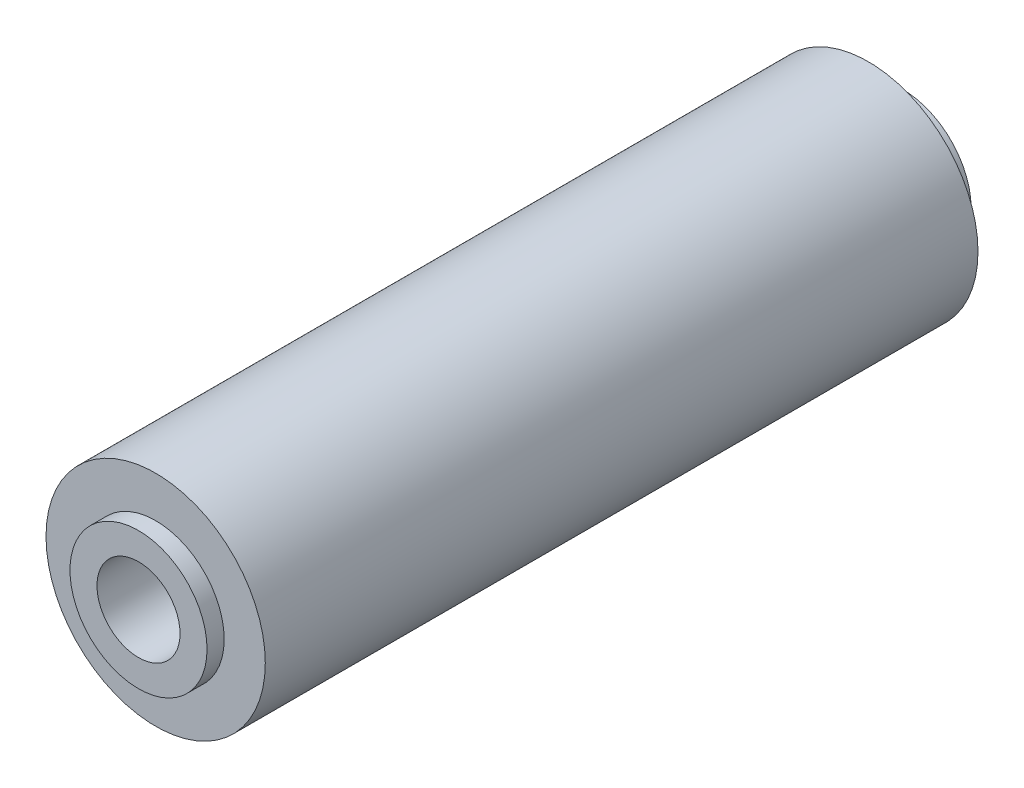
ISO-10303-21;
HEADER;
FILE_DESCRIPTION(('STEP AP214'),'2;1');
FILE_NAME('part.step','',(''),(''),'','','');
FILE_SCHEMA(('AUTOMOTIVE_DESIGN { 1 0 10303 214 1 1 1 1 }'));
ENDSEC;
DATA;
#1=APPLICATION_CONTEXT('core data for automotive mechanical design processes');
#2=APPLICATION_PROTOCOL_DEFINITION('international standard','automotive_design',2000,#1);
#3=PRODUCT_CONTEXT('',#1,'mechanical');
#4=PRODUCT('Part','Part','',(#3));
#5=PRODUCT_RELATED_PRODUCT_CATEGORY('part','',(#4));
#6=PRODUCT_DEFINITION_FORMATION('','',#4);
#7=PRODUCT_DEFINITION_CONTEXT('part definition',#1,'design');
#8=PRODUCT_DEFINITION('design','',#6,#7);
#9=PRODUCT_DEFINITION_SHAPE('','',#8);
#10=(LENGTH_UNIT() NAMED_UNIT(*) SI_UNIT(.MILLI.,.METRE.));
#11=(NAMED_UNIT(*) PLANE_ANGLE_UNIT() SI_UNIT($,.RADIAN.));
#12=(NAMED_UNIT(*) SI_UNIT($,.STERADIAN.) SOLID_ANGLE_UNIT());
#13=UNCERTAINTY_MEASURE_WITH_UNIT(LENGTH_MEASURE(1.E-05),#10,'distance_accuracy_value','');
#14=(GEOMETRIC_REPRESENTATION_CONTEXT(3) GLOBAL_UNCERTAINTY_ASSIGNED_CONTEXT((#13)) GLOBAL_UNIT_ASSIGNED_CONTEXT((#10,
#11,#12)) REPRESENTATION_CONTEXT('',''));
#15=CARTESIAN_POINT('',(0.,0.,0.));
#16=DIRECTION('',(0.,0.,1.));
#17=DIRECTION('',(1.,0.,0.));
#18=AXIS2_PLACEMENT_3D('',#15,#16,#17);
#19=CARTESIAN_POINT('',(0.,0.,52.));
#20=DIRECTION('',(0.,0.,-1.));
#21=DIRECTION('',(-1.,0.,0.));
#22=AXIS2_PLACEMENT_3D('',#19,#20,#21);
#23=CYLINDRICAL_SURFACE('',#22,8.);
#24=CARTESIAN_POINT('',(0.,0.,52.));
#25=DIRECTION('',(0.,0.,1.));
#26=DIRECTION('',(1.,0.,0.));
#27=AXIS2_PLACEMENT_3D('',#24,#25,#26);
#28=CIRCLE('',#27,8.);
#29=CARTESIAN_POINT('',(8.,0.,52.));
#30=VERTEX_POINT('',#29);
#31=EDGE_CURVE('E42',#30,#30,#28,.T.);
#32=ORIENTED_EDGE('',*,*,#31,.F.);
#33=EDGE_LOOP('',(#32));
#34=FACE_BOUND('',#33,.T.);
#35=CARTESIAN_POINT('',(0.,0.,0.));
#36=DIRECTION('',(0.,0.,1.));
#37=DIRECTION('',(1.,0.,0.));
#38=AXIS2_PLACEMENT_3D('',#35,#36,#37);
#39=CIRCLE('',#38,8.);
#40=CARTESIAN_POINT('',(8.,0.,0.));
#41=VERTEX_POINT('',#40);
#42=EDGE_CURVE('E47',#41,#41,#39,.T.);
#43=ORIENTED_EDGE('',*,*,#42,.T.);
#44=EDGE_LOOP('',(#43));
#45=FACE_BOUND('',#44,.T.);
#46=ADVANCED_FACE('F40',(#34,#45),#23,.T.);
#47=CARTESIAN_POINT('',(0.,0.,52.));
#48=DIRECTION('',(0.,0.,1.));
#49=DIRECTION('',(1.,0.,0.));
#50=AXIS2_PLACEMENT_3D('',#47,#48,#49);
#51=PLANE('',#50);
#52=CARTESIAN_POINT('',(0.,0.,52.));
#53=DIRECTION('',(0.,0.,1.));
#54=DIRECTION('',(1.,0.,0.));
#55=AXIS2_PLACEMENT_3D('',#52,#53,#54);
#56=CIRCLE('',#55,5.);
#57=CARTESIAN_POINT('',(5.,0.,52.));
#58=VERTEX_POINT('',#57);
#59=EDGE_CURVE('E10',#58,#58,#56,.T.);
#60=ORIENTED_EDGE('',*,*,#59,.F.);
#61=EDGE_LOOP('',(#60));
#62=FACE_BOUND('',#61,.T.);
#63=ORIENTED_EDGE('',*,*,#31,.T.);
#64=EDGE_LOOP('',(#63));
#65=FACE_BOUND('',#64,.T.);
#66=ADVANCED_FACE('F92',(#62,#65),#51,.T.);
#67=CARTESIAN_POINT('',(0.,0.,0.));
#68=DIRECTION('',(0.,0.,1.));
#69=DIRECTION('',(1.,0.,0.));
#70=AXIS2_PLACEMENT_3D('',#67,#68,#69);
#71=PLANE('',#70);
#72=CARTESIAN_POINT('',(0.,0.,0.));
#73=DIRECTION('',(0.,0.,1.));
#74=DIRECTION('',(1.,0.,0.));
#75=AXIS2_PLACEMENT_3D('',#72,#73,#74);
#76=CIRCLE('',#75,5.);
#77=CARTESIAN_POINT('',(5.,0.,0.));
#78=VERTEX_POINT('',#77);
#79=EDGE_CURVE('E54',#78,#78,#76,.T.);
#80=ORIENTED_EDGE('',*,*,#79,.T.);
#81=EDGE_LOOP('',(#80));
#82=FACE_BOUND('',#81,.T.);
#83=ORIENTED_EDGE('',*,*,#42,.F.);
#84=EDGE_LOOP('',(#83));
#85=FACE_BOUND('',#84,.T.);
#86=ADVANCED_FACE('F101',(#82,#85),#71,.F.);
#87=CARTESIAN_POINT('',(0.,0.,0.));
#88=DIRECTION('',(0.,0.,-1.));
#89=DIRECTION('',(-1.,0.,0.));
#90=AXIS2_PLACEMENT_3D('',#87,#88,#89);
#91=CYLINDRICAL_SURFACE('',#90,5.);
#92=ORIENTED_EDGE('',*,*,#79,.F.);
#93=EDGE_LOOP('',(#92));
#94=FACE_BOUND('',#93,.T.);
#95=CARTESIAN_POINT('',(0.,0.,-2.5));
#96=DIRECTION('',(0.,0.,1.));
#97=DIRECTION('',(1.,0.,0.));
#98=AXIS2_PLACEMENT_3D('',#95,#96,#97);
#99=CIRCLE('',#98,5.);
#100=CARTESIAN_POINT('',(5.,0.,-2.5));
#101=VERTEX_POINT('',#100);
#102=EDGE_CURVE('E59',#101,#101,#99,.T.);
#103=ORIENTED_EDGE('',*,*,#102,.T.);
#104=EDGE_LOOP('',(#103));
#105=FACE_BOUND('',#104,.T.);
#106=ADVANCED_FACE('F107',(#94,#105),#91,.T.);
#107=CARTESIAN_POINT('',(0.,0.,-2.5));
#108=DIRECTION('',(0.,0.,1.));
#109=DIRECTION('',(1.,0.,0.));
#110=AXIS2_PLACEMENT_3D('',#107,#108,#109);
#111=PLANE('',#110);
#112=CARTESIAN_POINT('',(0.,0.,-2.5));
#113=DIRECTION('',(0.,0.,1.));
#114=DIRECTION('',(1.,0.,0.));
#115=AXIS2_PLACEMENT_3D('',#112,#113,#114);
#116=CIRCLE('',#115,3.03);
#117=CARTESIAN_POINT('',(3.03,0.,-2.5));
#118=VERTEX_POINT('',#117);
#119=EDGE_CURVE('E64',#118,#118,#116,.F.);
#120=ORIENTED_EDGE('',*,*,#119,.F.);
#121=EDGE_LOOP('',(#120));
#122=FACE_BOUND('',#121,.T.);
#123=ORIENTED_EDGE('',*,*,#102,.F.);
#124=EDGE_LOOP('',(#123));
#125=FACE_BOUND('',#124,.T.);
#126=ADVANCED_FACE('F114',(#122,#125),#111,.F.);
#127=CARTESIAN_POINT('',(0.,0.,53.25));
#128=DIRECTION('',(0.,0.,-1.));
#129=DIRECTION('',(-1.,0.,0.));
#130=AXIS2_PLACEMENT_3D('',#127,#128,#129);
#131=CYLINDRICAL_SURFACE('',#130,5.);
#132=CARTESIAN_POINT('',(0.,0.,53.25));
#133=DIRECTION('',(0.,0.,1.));
#134=DIRECTION('',(1.,0.,0.));
#135=AXIS2_PLACEMENT_3D('',#132,#133,#134);
#136=CIRCLE('',#135,5.);
#137=CARTESIAN_POINT('',(5.,0.,53.25));
#138=VERTEX_POINT('',#137);
#139=EDGE_CURVE('E52',#138,#138,#136,.T.);
#140=ORIENTED_EDGE('',*,*,#139,.F.);
#141=EDGE_LOOP('',(#140));
#142=FACE_BOUND('',#141,.T.);
#143=ORIENTED_EDGE('',*,*,#59,.T.);
#144=EDGE_LOOP('',(#143));
#145=FACE_BOUND('',#144,.T.);
#146=ADVANCED_FACE('F116',(#142,#145),#131,.T.);
#147=CARTESIAN_POINT('',(0.,0.,53.25));
#148=DIRECTION('',(0.,0.,1.));
#149=DIRECTION('',(1.,0.,0.));
#150=AXIS2_PLACEMENT_3D('',#147,#148,#149);
#151=PLANE('',#150);
#152=CARTESIAN_POINT('',(0.,0.,53.25));
#153=DIRECTION('',(0.,0.,1.));
#154=DIRECTION('',(1.,0.,0.));
#155=AXIS2_PLACEMENT_3D('',#152,#153,#154);
#156=CIRCLE('',#155,3.03);
#157=CARTESIAN_POINT('',(3.03,0.,53.25));
#158=VERTEX_POINT('',#157);
#159=EDGE_CURVE('E37',#158,#158,#156,.F.);
#160=ORIENTED_EDGE('',*,*,#159,.T.);
#161=EDGE_LOOP('',(#160));
#162=FACE_BOUND('',#161,.T.);
#163=ORIENTED_EDGE('',*,*,#139,.T.);
#164=EDGE_LOOP('',(#163));
#165=FACE_BOUND('',#164,.T.);
#166=ADVANCED_FACE('F122',(#162,#165),#151,.T.);
#167=CARTESIAN_POINT('',(0.,0.,11.5));
#168=DIRECTION('',(0.,0.,-1.));
#169=DIRECTION('',(-1.,0.,0.));
#170=AXIS2_PLACEMENT_3D('',#167,#168,#169);
#171=CYLINDRICAL_SURFACE('',#170,3.03);
#172=CARTESIAN_POINT('',(0.,0.,11.5));
#173=DIRECTION('',(0.,0.,1.));
#174=DIRECTION('',(1.,0.,0.));
#175=AXIS2_PLACEMENT_3D('',#172,#173,#174);
#176=CIRCLE('',#175,3.03);
#177=CARTESIAN_POINT('',(3.03,0.,11.5));
#178=VERTEX_POINT('',#177);
#179=EDGE_CURVE('E61',#178,#178,#176,.T.);
#180=ORIENTED_EDGE('',*,*,#179,.T.);
#181=EDGE_LOOP('',(#180));
#182=FACE_BOUND('',#181,.T.);
#183=ORIENTED_EDGE('',*,*,#119,.T.);
#184=EDGE_LOOP('',(#183));
#185=FACE_BOUND('',#184,.T.);
#186=ADVANCED_FACE('F89',(#182,#185),#171,.F.);
#187=CARTESIAN_POINT('',(0.,0.,11.5));
#188=DIRECTION('',(0.,0.,1.));
#189=DIRECTION('',(1.,0.,0.));
#190=AXIS2_PLACEMENT_3D('',#187,#188,#189);
#191=PLANE('',#190);
#192=ORIENTED_EDGE('',*,*,#179,.F.);
#193=EDGE_LOOP('',(#192));
#194=FACE_BOUND('',#193,.T.);
#195=ADVANCED_FACE('F81',(#194),#191,.F.);
#196=CARTESIAN_POINT('',(0.,0.,53.5));
#197=DIRECTION('',(0.,0.,-1.));
#198=DIRECTION('',(-1.,0.,0.));
#199=AXIS2_PLACEMENT_3D('',#196,#197,#198);
#200=CYLINDRICAL_SURFACE('',#199,3.03);
#201=ORIENTED_EDGE('',*,*,#159,.F.);
#202=EDGE_LOOP('',(#201));
#203=FACE_BOUND('',#202,.T.);
#204=CARTESIAN_POINT('',(0.,0.,38.5));
#205=DIRECTION('',(0.,0.,1.));
#206=DIRECTION('',(1.,0.,0.));
#207=AXIS2_PLACEMENT_3D('',#204,#205,#206);
#208=CIRCLE('',#207,3.03);
#209=CARTESIAN_POINT('',(3.03,0.,38.5));
#210=VERTEX_POINT('',#209);
#211=EDGE_CURVE('E75',#210,#210,#208,.T.);
#212=ORIENTED_EDGE('',*,*,#211,.F.);
#213=EDGE_LOOP('',(#212));
#214=FACE_BOUND('',#213,.T.);
#215=ADVANCED_FACE('F76',(#203,#214),#200,.F.);
#216=CARTESIAN_POINT('',(0.,0.,38.5));
#217=DIRECTION('',(0.,0.,1.));
#218=DIRECTION('',(1.,0.,0.));
#219=AXIS2_PLACEMENT_3D('',#216,#217,#218);
#220=PLANE('',#219);
#221=ORIENTED_EDGE('',*,*,#211,.T.);
#222=EDGE_LOOP('',(#221));
#223=FACE_BOUND('',#222,.T.);
#224=ADVANCED_FACE('F79',(#223),#220,.T.);
#225=CLOSED_SHELL('',(#46,#66,#86,#106,#126,#146,#166,#186,#195,#215,#224));
#226=MANIFOLD_SOLID_BREP('B2',#225);
#227=ADVANCED_BREP_SHAPE_REPRESENTATION('',(#18,#226),#14);
#228=SHAPE_DEFINITION_REPRESENTATION(#9,#227);
ENDSEC;
END-ISO-10303-21;
